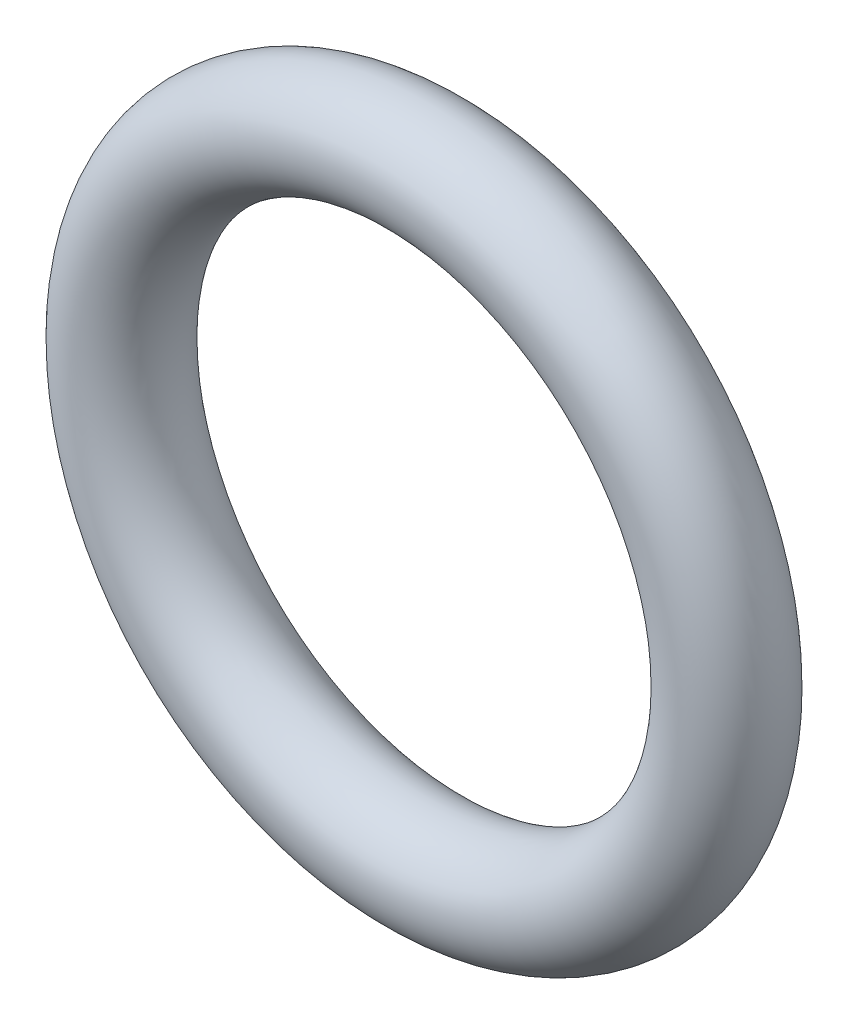
ISO-10303-21;
HEADER;
FILE_DESCRIPTION(('STEP AP214'),'2;1');
FILE_NAME('part.step','',(''),(''),'','','');
FILE_SCHEMA(('AUTOMOTIVE_DESIGN { 1 0 10303 214 1 1 1 1 }'));
ENDSEC;
DATA;
#1=APPLICATION_CONTEXT('core data for automotive mechanical design processes');
#2=APPLICATION_PROTOCOL_DEFINITION('international standard','automotive_design',2000,#1);
#3=PRODUCT_CONTEXT('',#1,'mechanical');
#4=PRODUCT('Part','Part','',(#3));
#5=PRODUCT_RELATED_PRODUCT_CATEGORY('part','',(#4));
#6=PRODUCT_DEFINITION_FORMATION('','',#4);
#7=PRODUCT_DEFINITION_CONTEXT('part definition',#1,'design');
#8=PRODUCT_DEFINITION('design','',#6,#7);
#9=PRODUCT_DEFINITION_SHAPE('','',#8);
#10=(LENGTH_UNIT() NAMED_UNIT(*) SI_UNIT(.MILLI.,.METRE.));
#11=(NAMED_UNIT(*) PLANE_ANGLE_UNIT() SI_UNIT($,.RADIAN.));
#12=(NAMED_UNIT(*) SI_UNIT($,.STERADIAN.) SOLID_ANGLE_UNIT());
#13=UNCERTAINTY_MEASURE_WITH_UNIT(LENGTH_MEASURE(1.E-05),#10,'distance_accuracy_value','');
#14=(GEOMETRIC_REPRESENTATION_CONTEXT(3) GLOBAL_UNCERTAINTY_ASSIGNED_CONTEXT((#13)) GLOBAL_UNIT_ASSIGNED_CONTEXT((#10,
#11,#12)) REPRESENTATION_CONTEXT('',''));
#15=CARTESIAN_POINT('',(0.,0.,0.));
#16=DIRECTION('',(0.,0.,1.));
#17=DIRECTION('',(1.,0.,0.));
#18=AXIS2_PLACEMENT_3D('',#15,#16,#17);
#19=CARTESIAN_POINT('',(0.,0.,0.));
#20=DIRECTION('',(0.,0.,1.));
#21=DIRECTION('',(1.,0.,0.));
#22=AXIS2_PLACEMENT_3D('',#19,#20,#21);
#23=TOROIDAL_SURFACE('',#22,4.25,0.75);
#24=CARTESIAN_POINT('',(5.,0.,0.));
#25=VERTEX_POINT('',#24);
#26=VERTEX_LOOP('',#25);
#27=FACE_BOUND('',#26,.T.);
#28=ADVANCED_FACE('F29',(#27),#23,.T.);
#29=CLOSED_SHELL('',(#28));
#30=MANIFOLD_SOLID_BREP('B2',#29);
#31=ADVANCED_BREP_SHAPE_REPRESENTATION('',(#18,#30),#14);
#32=SHAPE_DEFINITION_REPRESENTATION(#9,#31);
ENDSEC;
END-ISO-10303-21;
